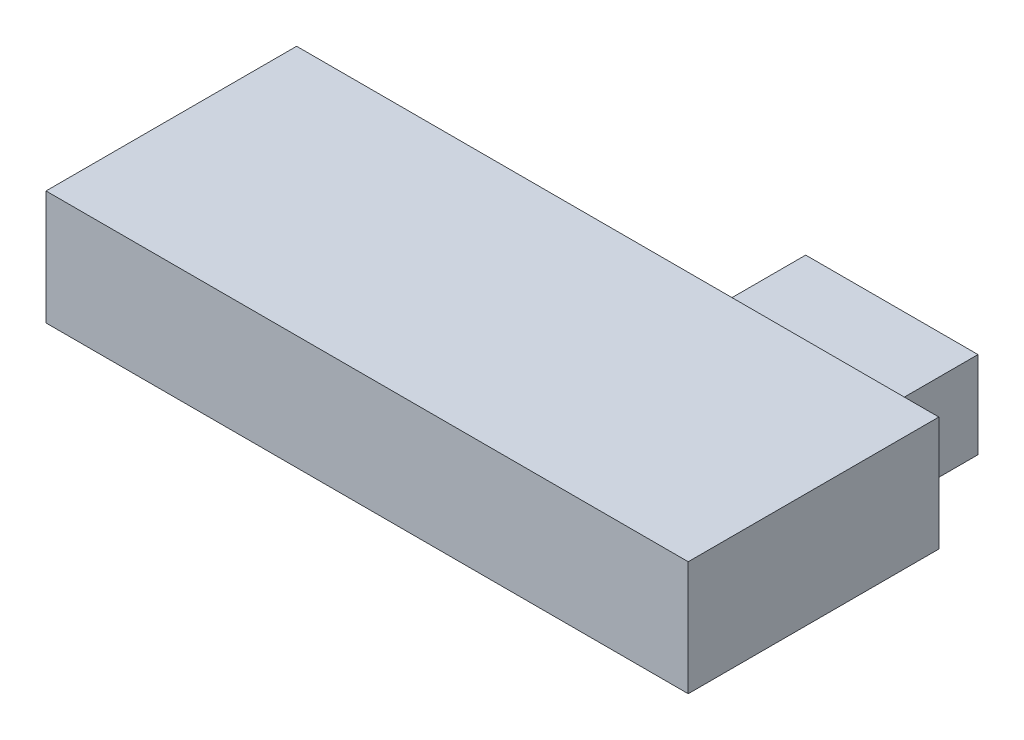
ISO-10303-21;
HEADER;
FILE_DESCRIPTION(('STEP AP214'),'2;1');
FILE_NAME('part.step','',(''),(''),'','','');
FILE_SCHEMA(('AUTOMOTIVE_DESIGN { 1 0 10303 214 1 1 1 1 }'));
ENDSEC;
DATA;
#1=APPLICATION_CONTEXT('core data for automotive mechanical design processes');
#2=APPLICATION_PROTOCOL_DEFINITION('international standard','automotive_design',2000,#1);
#3=PRODUCT_CONTEXT('',#1,'mechanical');
#4=PRODUCT('Part','Part','',(#3));
#5=PRODUCT_RELATED_PRODUCT_CATEGORY('part','',(#4));
#6=PRODUCT_DEFINITION_FORMATION('','',#4);
#7=PRODUCT_DEFINITION_CONTEXT('part definition',#1,'design');
#8=PRODUCT_DEFINITION('design','',#6,#7);
#9=PRODUCT_DEFINITION_SHAPE('','',#8);
#10=(LENGTH_UNIT() NAMED_UNIT(*) SI_UNIT(.MILLI.,.METRE.));
#11=(NAMED_UNIT(*) PLANE_ANGLE_UNIT() SI_UNIT($,.RADIAN.));
#12=(NAMED_UNIT(*) SI_UNIT($,.STERADIAN.) SOLID_ANGLE_UNIT());
#13=UNCERTAINTY_MEASURE_WITH_UNIT(LENGTH_MEASURE(1.E-05),#10,'distance_accuracy_value','');
#14=(GEOMETRIC_REPRESENTATION_CONTEXT(3) GLOBAL_UNCERTAINTY_ASSIGNED_CONTEXT((#13)) GLOBAL_UNIT_ASSIGNED_CONTEXT((#10,
#11,#12)) REPRESENTATION_CONTEXT('',''));
#15=CARTESIAN_POINT('',(0.,0.,0.));
#16=DIRECTION('',(0.,0.,1.));
#17=DIRECTION('',(1.,0.,0.));
#18=AXIS2_PLACEMENT_3D('',#15,#16,#17);
#19=CARTESIAN_POINT('',(0.,7.3,-16.));
#20=DIRECTION('',(0.,0.,1.));
#21=DIRECTION('',(1.,0.,0.));
#22=AXIS2_PLACEMENT_3D('',#19,#20,#21);
#23=PLANE('',#22);
#24=DIRECTION('',(-1.,0.,0.));
#25=VECTOR('',#24,1.);
#26=CARTESIAN_POINT('',(0.,0.,-16.));
#27=LINE('',#26,#25);
#28=CARTESIAN_POINT('',(41.,0.,-16.));
#29=VERTEX_POINT('',#28);
#30=CARTESIAN_POINT('',(0.,0.,-16.));
#31=VERTEX_POINT('',#30);
#32=EDGE_CURVE('E133',#29,#31,#27,.T.);
#33=ORIENTED_EDGE('',*,*,#32,.T.);
#34=DIRECTION('',(0.,-1.,0.));
#35=VECTOR('',#34,1.);
#36=CARTESIAN_POINT('',(0.,7.3,-16.));
#37=LINE('',#36,#35);
#38=CARTESIAN_POINT('',(0.,7.3,-16.));
#39=VERTEX_POINT('',#38);
#40=EDGE_CURVE('E138',#39,#31,#37,.T.);
#41=ORIENTED_EDGE('',*,*,#40,.F.);
#42=DIRECTION('',(-1.,0.,0.));
#43=VECTOR('',#42,1.);
#44=CARTESIAN_POINT('',(0.,7.3,-16.));
#45=LINE('',#44,#43);
#46=CARTESIAN_POINT('',(41.,7.3,-16.));
#47=VERTEX_POINT('',#46);
#48=EDGE_CURVE('E137',#47,#39,#45,.T.);
#49=ORIENTED_EDGE('',*,*,#48,.F.);
#50=DIRECTION('',(0.,-1.,0.));
#51=VECTOR('',#50,1.);
#52=CARTESIAN_POINT('',(41.,7.3,-16.));
#53=LINE('',#52,#51);
#54=EDGE_CURVE('E146',#47,#29,#53,.T.);
#55=ORIENTED_EDGE('',*,*,#54,.T.);
#56=EDGE_LOOP('',(#33,#41,#49,#55));
#57=FACE_BOUND('',#56,.T.);
#58=DIRECTION('',(0.,1.,0.));
#59=VECTOR('',#58,1.);
#60=CARTESIAN_POINT('',(27.,6.5041785699782,-16.));
#61=LINE('',#60,#59);
#62=CARTESIAN_POINT('',(27.,0.964957937872197,-16.));
#63=VERTEX_POINT('',#62);
#64=CARTESIAN_POINT('',(27.,6.5041785699782,-16.));
#65=VERTEX_POINT('',#64);
#66=EDGE_CURVE('E119',#63,#65,#61,.T.);
#67=ORIENTED_EDGE('',*,*,#66,.F.);
#68=DIRECTION('',(-1.,0.,0.));
#69=VECTOR('',#68,1.);
#70=CARTESIAN_POINT('',(27.,0.964957937872197,-16.));
#71=LINE('',#70,#69);
#72=CARTESIAN_POINT('',(38.,0.964957937872197,-16.));
#73=VERTEX_POINT('',#72);
#74=EDGE_CURVE('E116',#73,#63,#71,.T.);
#75=ORIENTED_EDGE('',*,*,#74,.F.);
#76=DIRECTION('',(0.,-1.,0.));
#77=VECTOR('',#76,1.);
#78=CARTESIAN_POINT('',(38.,6.5041785699782,-16.));
#79=LINE('',#78,#77);
#80=CARTESIAN_POINT('',(38.,6.5041785699782,-16.));
#81=VERTEX_POINT('',#80);
#82=EDGE_CURVE('E54',#81,#73,#79,.T.);
#83=ORIENTED_EDGE('',*,*,#82,.F.);
#84=DIRECTION('',(1.,0.,0.));
#85=VECTOR('',#84,1.);
#86=CARTESIAN_POINT('',(27.,6.5041785699782,-16.));
#87=LINE('',#86,#85);
#88=EDGE_CURVE('E49',#65,#81,#87,.T.);
#89=ORIENTED_EDGE('',*,*,#88,.F.);
#90=EDGE_LOOP('',(#67,#75,#83,#89));
#91=FACE_BOUND('',#90,.T.);
#92=ADVANCED_FACE('F34',(#57,#91),#23,.F.);
#93=CARTESIAN_POINT('',(0.,7.3,0.));
#94=DIRECTION('',(1.,0.,0.));
#95=DIRECTION('',(0.,0.,-1.));
#96=AXIS2_PLACEMENT_3D('',#93,#94,#95);
#97=PLANE('',#96);
#98=DIRECTION('',(0.,0.,1.));
#99=VECTOR('',#98,1.);
#100=CARTESIAN_POINT('',(0.,0.,0.));
#101=LINE('',#100,#99);
#102=CARTESIAN_POINT('',(0.,0.,0.));
#103=VERTEX_POINT('',#102);
#104=EDGE_CURVE('E120',#31,#103,#101,.T.);
#105=ORIENTED_EDGE('',*,*,#104,.T.);
#106=DIRECTION('',(0.,-1.,0.));
#107=VECTOR('',#106,1.);
#108=CARTESIAN_POINT('',(0.,7.3,0.));
#109=LINE('',#108,#107);
#110=CARTESIAN_POINT('',(0.,7.3,0.));
#111=VERTEX_POINT('',#110);
#112=EDGE_CURVE('E11',#111,#103,#109,.T.);
#113=ORIENTED_EDGE('',*,*,#112,.F.);
#114=DIRECTION('',(0.,0.,1.));
#115=VECTOR('',#114,1.);
#116=CARTESIAN_POINT('',(0.,7.3,0.));
#117=LINE('',#116,#115);
#118=EDGE_CURVE('E129',#39,#111,#117,.T.);
#119=ORIENTED_EDGE('',*,*,#118,.F.);
#120=ORIENTED_EDGE('',*,*,#40,.T.);
#121=EDGE_LOOP('',(#105,#113,#119,#120));
#122=FACE_BOUND('',#121,.T.);
#123=ADVANCED_FACE('F36',(#122),#97,.F.);
#124=CARTESIAN_POINT('',(0.,7.3,0.));
#125=DIRECTION('',(0.,0.,-1.));
#126=DIRECTION('',(-1.,0.,0.));
#127=AXIS2_PLACEMENT_3D('',#124,#125,#126);
#128=PLANE('',#127);
#129=DIRECTION('',(1.,0.,0.));
#130=VECTOR('',#129,1.);
#131=CARTESIAN_POINT('',(0.,0.,0.));
#132=LINE('',#131,#130);
#133=CARTESIAN_POINT('',(41.,0.,0.));
#134=VERTEX_POINT('',#133);
#135=EDGE_CURVE('E123',#103,#134,#132,.T.);
#136=ORIENTED_EDGE('',*,*,#135,.T.);
#137=DIRECTION('',(0.,-1.,0.));
#138=VECTOR('',#137,1.);
#139=CARTESIAN_POINT('',(41.,7.3,0.));
#140=LINE('',#139,#138);
#141=CARTESIAN_POINT('',(41.,7.3,0.));
#142=VERTEX_POINT('',#141);
#143=EDGE_CURVE('E42',#142,#134,#140,.T.);
#144=ORIENTED_EDGE('',*,*,#143,.F.);
#145=DIRECTION('',(1.,0.,0.));
#146=VECTOR('',#145,1.);
#147=CARTESIAN_POINT('',(0.,7.3,0.));
#148=LINE('',#147,#146);
#149=EDGE_CURVE('E132',#111,#142,#148,.T.);
#150=ORIENTED_EDGE('',*,*,#149,.F.);
#151=ORIENTED_EDGE('',*,*,#112,.T.);
#152=EDGE_LOOP('',(#136,#144,#150,#151));
#153=FACE_BOUND('',#152,.T.);
#154=ADVANCED_FACE('F168',(#153),#128,.F.);
#155=CARTESIAN_POINT('',(41.,7.3,0.));
#156=DIRECTION('',(-1.,0.,0.));
#157=DIRECTION('',(0.,0.,1.));
#158=AXIS2_PLACEMENT_3D('',#155,#156,#157);
#159=PLANE('',#158);
#160=DIRECTION('',(0.,0.,-1.));
#161=VECTOR('',#160,1.);
#162=CARTESIAN_POINT('',(41.,0.,0.));
#163=LINE('',#162,#161);
#164=EDGE_CURVE('E141',#134,#29,#163,.T.);
#165=ORIENTED_EDGE('',*,*,#164,.T.);
#166=ORIENTED_EDGE('',*,*,#54,.F.);
#167=DIRECTION('',(0.,0.,-1.));
#168=VECTOR('',#167,1.);
#169=CARTESIAN_POINT('',(41.,7.3,0.));
#170=LINE('',#169,#168);
#171=EDGE_CURVE('E135',#142,#47,#170,.T.);
#172=ORIENTED_EDGE('',*,*,#171,.F.);
#173=ORIENTED_EDGE('',*,*,#143,.T.);
#174=EDGE_LOOP('',(#165,#166,#172,#173));
#175=FACE_BOUND('',#174,.T.);
#176=ADVANCED_FACE('F153',(#175),#159,.F.);
#177=CARTESIAN_POINT('',(0.,7.3,0.));
#178=DIRECTION('',(0.,-1.,0.));
#179=DIRECTION('',(0.,0.,-1.));
#180=AXIS2_PLACEMENT_3D('',#177,#178,#179);
#181=PLANE('',#180);
#182=ORIENTED_EDGE('',*,*,#118,.T.);
#183=ORIENTED_EDGE('',*,*,#149,.T.);
#184=ORIENTED_EDGE('',*,*,#171,.T.);
#185=ORIENTED_EDGE('',*,*,#48,.T.);
#186=EDGE_LOOP('',(#182,#183,#184,#185));
#187=FACE_BOUND('',#186,.T.);
#188=ADVANCED_FACE('F167',(#187),#181,.F.);
#189=CARTESIAN_POINT('',(0.,0.,0.));
#190=DIRECTION('',(0.,-1.,0.));
#191=DIRECTION('',(0.,0.,-1.));
#192=AXIS2_PLACEMENT_3D('',#189,#190,#191);
#193=PLANE('',#192);
#194=ORIENTED_EDGE('',*,*,#104,.F.);
#195=ORIENTED_EDGE('',*,*,#32,.F.);
#196=ORIENTED_EDGE('',*,*,#164,.F.);
#197=ORIENTED_EDGE('',*,*,#135,.F.);
#198=EDGE_LOOP('',(#194,#195,#196,#197));
#199=FACE_BOUND('',#198,.T.);
#200=ADVANCED_FACE('F159',(#199),#193,.T.);
#201=CARTESIAN_POINT('',(27.,6.5041785699782,-21.5));
#202=DIRECTION('',(1.,0.,0.));
#203=DIRECTION('',(0.,0.,-1.));
#204=AXIS2_PLACEMENT_3D('',#201,#202,#203);
#205=PLANE('',#204);
#206=ORIENTED_EDGE('',*,*,#66,.T.);
#207=DIRECTION('',(0.,0.,1.));
#208=VECTOR('',#207,1.);
#209=CARTESIAN_POINT('',(27.,6.5041785699782,-21.5));
#210=LINE('',#209,#208);
#211=CARTESIAN_POINT('',(27.,6.5041785699782,-21.5));
#212=VERTEX_POINT('',#211);
#213=EDGE_CURVE('E100',#212,#65,#210,.T.);
#214=ORIENTED_EDGE('',*,*,#213,.F.);
#215=DIRECTION('',(0.,1.,0.));
#216=VECTOR('',#215,1.);
#217=CARTESIAN_POINT('',(27.,6.5041785699782,-21.5));
#218=LINE('',#217,#216);
#219=CARTESIAN_POINT('',(27.,0.964957937872197,-21.5));
#220=VERTEX_POINT('',#219);
#221=EDGE_CURVE('E107',#220,#212,#218,.T.);
#222=ORIENTED_EDGE('',*,*,#221,.F.);
#223=DIRECTION('',(0.,0.,1.));
#224=VECTOR('',#223,1.);
#225=CARTESIAN_POINT('',(27.,0.964957937872197,-21.5));
#226=LINE('',#225,#224);
#227=EDGE_CURVE('E261',#220,#63,#226,.T.);
#228=ORIENTED_EDGE('',*,*,#227,.T.);
#229=EDGE_LOOP('',(#206,#214,#222,#228));
#230=FACE_BOUND('',#229,.T.);
#231=ADVANCED_FACE('F118',(#230),#205,.F.);
#232=CARTESIAN_POINT('',(27.,6.5041785699782,-21.5));
#233=DIRECTION('',(0.,-1.,0.));
#234=DIRECTION('',(0.,0.,-1.));
#235=AXIS2_PLACEMENT_3D('',#232,#233,#234);
#236=PLANE('',#235);
#237=ORIENTED_EDGE('',*,*,#88,.T.);
#238=DIRECTION('',(0.,0.,1.));
#239=VECTOR('',#238,1.);
#240=CARTESIAN_POINT('',(38.,6.5041785699782,-21.5));
#241=LINE('',#240,#239);
#242=CARTESIAN_POINT('',(38.,6.5041785699782,-21.5));
#243=VERTEX_POINT('',#242);
#244=EDGE_CURVE('E103',#243,#81,#241,.T.);
#245=ORIENTED_EDGE('',*,*,#244,.F.);
#246=DIRECTION('',(1.,0.,0.));
#247=VECTOR('',#246,1.);
#248=CARTESIAN_POINT('',(27.,6.5041785699782,-21.5));
#249=LINE('',#248,#247);
#250=EDGE_CURVE('E96',#212,#243,#249,.T.);
#251=ORIENTED_EDGE('',*,*,#250,.F.);
#252=ORIENTED_EDGE('',*,*,#213,.T.);
#253=EDGE_LOOP('',(#237,#245,#251,#252));
#254=FACE_BOUND('',#253,.T.);
#255=ADVANCED_FACE('F98',(#254),#236,.F.);
#256=CARTESIAN_POINT('',(38.,6.5041785699782,-21.5));
#257=DIRECTION('',(-1.,0.,0.));
#258=DIRECTION('',(0.,0.,1.));
#259=AXIS2_PLACEMENT_3D('',#256,#257,#258);
#260=PLANE('',#259);
#261=ORIENTED_EDGE('',*,*,#82,.T.);
#262=DIRECTION('',(0.,0.,1.));
#263=VECTOR('',#262,1.);
#264=CARTESIAN_POINT('',(38.,0.964957937872197,-21.5));
#265=LINE('',#264,#263);
#266=CARTESIAN_POINT('',(38.,0.964957937872197,-21.5));
#267=VERTEX_POINT('',#266);
#268=EDGE_CURVE('E125',#267,#73,#265,.T.);
#269=ORIENTED_EDGE('',*,*,#268,.F.);
#270=DIRECTION('',(0.,-1.,0.));
#271=VECTOR('',#270,1.);
#272=CARTESIAN_POINT('',(38.,6.5041785699782,-21.5));
#273=LINE('',#272,#271);
#274=EDGE_CURVE('E106',#243,#267,#273,.T.);
#275=ORIENTED_EDGE('',*,*,#274,.F.);
#276=ORIENTED_EDGE('',*,*,#244,.T.);
#277=EDGE_LOOP('',(#261,#269,#275,#276));
#278=FACE_BOUND('',#277,.T.);
#279=ADVANCED_FACE('F188',(#278),#260,.F.);
#280=CARTESIAN_POINT('',(27.,0.964957937872197,-21.5));
#281=DIRECTION('',(0.,1.,0.));
#282=DIRECTION('',(0.,0.,1.));
#283=AXIS2_PLACEMENT_3D('',#280,#281,#282);
#284=PLANE('',#283);
#285=ORIENTED_EDGE('',*,*,#74,.T.);
#286=ORIENTED_EDGE('',*,*,#227,.F.);
#287=DIRECTION('',(-1.,0.,0.));
#288=VECTOR('',#287,1.);
#289=CARTESIAN_POINT('',(27.,0.964957937872197,-21.5));
#290=LINE('',#289,#288);
#291=EDGE_CURVE('E112',#267,#220,#290,.T.);
#292=ORIENTED_EDGE('',*,*,#291,.F.);
#293=ORIENTED_EDGE('',*,*,#268,.T.);
#294=EDGE_LOOP('',(#285,#286,#292,#293));
#295=FACE_BOUND('',#294,.T.);
#296=ADVANCED_FACE('F191',(#295),#284,.F.);
#297=CARTESIAN_POINT('',(0.,0.,-21.5));
#298=DIRECTION('',(0.,0.,1.));
#299=DIRECTION('',(1.,0.,0.));
#300=AXIS2_PLACEMENT_3D('',#297,#298,#299);
#301=PLANE('',#300);
#302=ORIENTED_EDGE('',*,*,#221,.T.);
#303=ORIENTED_EDGE('',*,*,#250,.T.);
#304=ORIENTED_EDGE('',*,*,#274,.T.);
#305=ORIENTED_EDGE('',*,*,#291,.T.);
#306=EDGE_LOOP('',(#302,#303,#304,#305));
#307=FACE_BOUND('',#306,.T.);
#308=ADVANCED_FACE('F110',(#307),#301,.F.);
#309=CLOSED_SHELL('',(#92,#123,#154,#176,#188,#200,#231,#255,#279,#296,#308));
#310=MANIFOLD_SOLID_BREP('B2',#309);
#311=ADVANCED_BREP_SHAPE_REPRESENTATION('',(#18,#310),#14);
#312=SHAPE_DEFINITION_REPRESENTATION(#9,#311);
ENDSEC;
END-ISO-10303-21;
